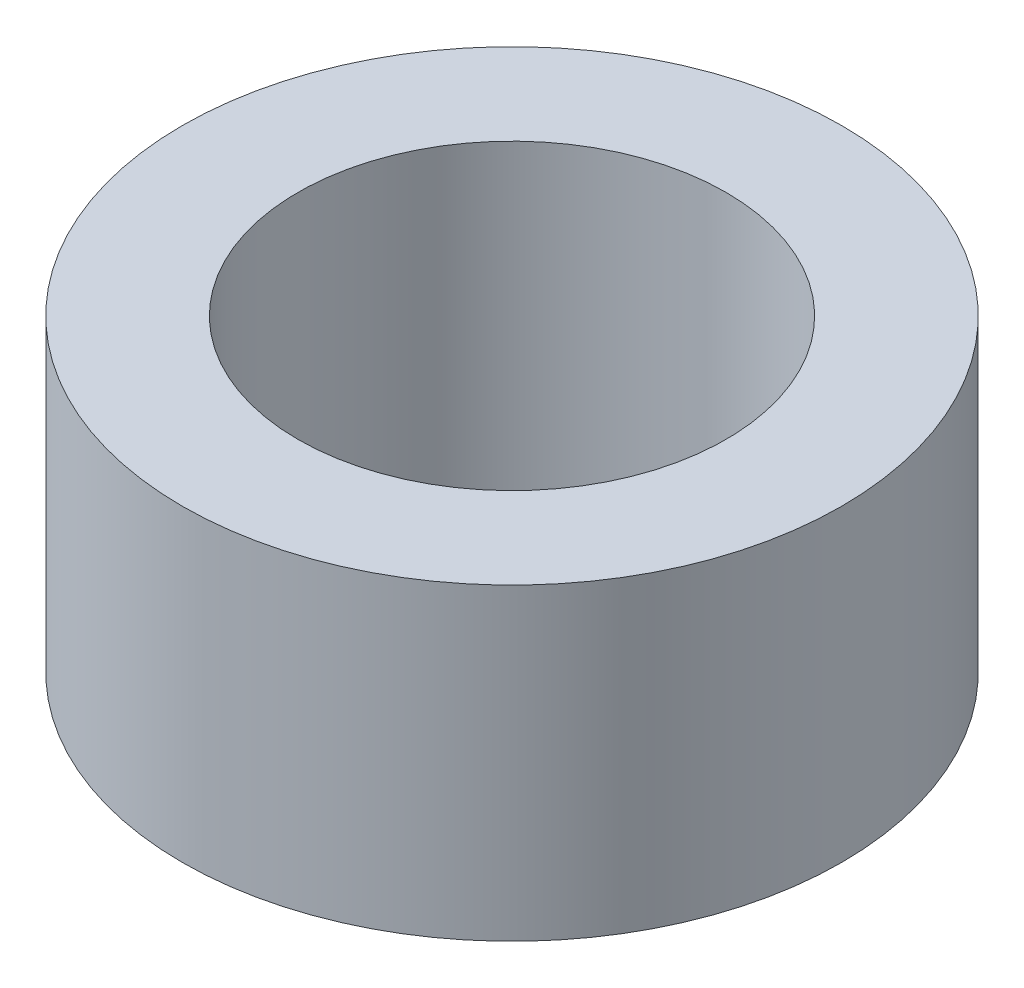
ISO-10303-21;
HEADER;
FILE_DESCRIPTION(('STEP AP214'),'2;1');
FILE_NAME('part.step','',(''),(''),'','','');
FILE_SCHEMA(('AUTOMOTIVE_DESIGN { 1 0 10303 214 1 1 1 1 }'));
ENDSEC;
DATA;
#1=APPLICATION_CONTEXT('core data for automotive mechanical design processes');
#2=APPLICATION_PROTOCOL_DEFINITION('international standard','automotive_design',2000,#1);
#3=PRODUCT_CONTEXT('',#1,'mechanical');
#4=PRODUCT('Part','Part','',(#3));
#5=PRODUCT_RELATED_PRODUCT_CATEGORY('part','',(#4));
#6=PRODUCT_DEFINITION_FORMATION('','',#4);
#7=PRODUCT_DEFINITION_CONTEXT('part definition',#1,'design');
#8=PRODUCT_DEFINITION('design','',#6,#7);
#9=PRODUCT_DEFINITION_SHAPE('','',#8);
#10=(LENGTH_UNIT() NAMED_UNIT(*) SI_UNIT(.MILLI.,.METRE.));
#11=(NAMED_UNIT(*) PLANE_ANGLE_UNIT() SI_UNIT($,.RADIAN.));
#12=(NAMED_UNIT(*) SI_UNIT($,.STERADIAN.) SOLID_ANGLE_UNIT());
#13=UNCERTAINTY_MEASURE_WITH_UNIT(LENGTH_MEASURE(1.E-05),#10,'distance_accuracy_value','');
#14=(GEOMETRIC_REPRESENTATION_CONTEXT(3) GLOBAL_UNCERTAINTY_ASSIGNED_CONTEXT((#13)) GLOBAL_UNIT_ASSIGNED_CONTEXT((#10,
#11,#12)) REPRESENTATION_CONTEXT('',''));
#15=CARTESIAN_POINT('',(0.,0.,0.));
#16=DIRECTION('',(0.,0.,1.));
#17=DIRECTION('',(1.,0.,0.));
#18=AXIS2_PLACEMENT_3D('',#15,#16,#17);
#19=CARTESIAN_POINT('',(0.,4.,0.));
#20=DIRECTION('',(0.,1.,0.));
#21=DIRECTION('',(0.,0.,1.));
#22=AXIS2_PLACEMENT_3D('',#19,#20,#21);
#23=PLANE('',#22);
#24=CARTESIAN_POINT('',(0.,4.,0.));
#25=DIRECTION('',(0.,1.,0.));
#26=DIRECTION('',(0.,0.,1.));
#27=AXIS2_PLACEMENT_3D('',#24,#25,#26);
#28=CIRCLE('',#27,4.275);
#29=CARTESIAN_POINT('',(0.,4.,4.275));
#30=VERTEX_POINT('',#29);
#31=EDGE_CURVE('E10',#30,#30,#28,.T.);
#32=ORIENTED_EDGE('',*,*,#31,.T.);
#33=EDGE_LOOP('',(#32));
#34=FACE_BOUND('',#33,.T.);
#35=CARTESIAN_POINT('',(0.,4.,0.));
#36=DIRECTION('',(0.,1.,0.));
#37=DIRECTION('',(0.,0.,1.));
#38=AXIS2_PLACEMENT_3D('',#35,#36,#37);
#39=CIRCLE('',#38,2.775);
#40=CARTESIAN_POINT('',(0.,4.,2.775));
#41=VERTEX_POINT('',#40);
#42=EDGE_CURVE('E50',#41,#41,#39,.T.);
#43=ORIENTED_EDGE('',*,*,#42,.F.);
#44=EDGE_LOOP('',(#43));
#45=FACE_BOUND('',#44,.T.);
#46=ADVANCED_FACE('F37',(#34,#45),#23,.T.);
#47=CARTESIAN_POINT('',(0.,0.,0.));
#48=DIRECTION('',(0.,1.,0.));
#49=DIRECTION('',(0.,0.,1.));
#50=AXIS2_PLACEMENT_3D('',#47,#48,#49);
#51=PLANE('',#50);
#52=CARTESIAN_POINT('',(0.,0.,0.));
#53=DIRECTION('',(0.,1.,0.));
#54=DIRECTION('',(0.,0.,1.));
#55=AXIS2_PLACEMENT_3D('',#52,#53,#54);
#56=CIRCLE('',#55,4.275);
#57=CARTESIAN_POINT('',(0.,0.,4.275));
#58=VERTEX_POINT('',#57);
#59=EDGE_CURVE('E41',#58,#58,#56,.T.);
#60=ORIENTED_EDGE('',*,*,#59,.F.);
#61=EDGE_LOOP('',(#60));
#62=FACE_BOUND('',#61,.T.);
#63=CARTESIAN_POINT('',(0.,0.,0.));
#64=DIRECTION('',(0.,1.,0.));
#65=DIRECTION('',(0.,0.,1.));
#66=AXIS2_PLACEMENT_3D('',#63,#64,#65);
#67=CIRCLE('',#66,2.775);
#68=CARTESIAN_POINT('',(0.,0.,2.775));
#69=VERTEX_POINT('',#68);
#70=EDGE_CURVE('E52',#69,#69,#67,.T.);
#71=ORIENTED_EDGE('',*,*,#70,.T.);
#72=EDGE_LOOP('',(#71));
#73=FACE_BOUND('',#72,.T.);
#74=ADVANCED_FACE('F64',(#62,#73),#51,.F.);
#75=CARTESIAN_POINT('',(0.,4.,0.));
#76=DIRECTION('',(0.,-1.,0.));
#77=DIRECTION('',(0.,0.,-1.));
#78=AXIS2_PLACEMENT_3D('',#75,#76,#77);
#79=CYLINDRICAL_SURFACE('',#78,4.275);
#80=ORIENTED_EDGE('',*,*,#31,.F.);
#81=EDGE_LOOP('',(#80));
#82=FACE_BOUND('',#81,.T.);
#83=ORIENTED_EDGE('',*,*,#59,.T.);
#84=EDGE_LOOP('',(#83));
#85=FACE_BOUND('',#84,.T.);
#86=ADVANCED_FACE('F39',(#82,#85),#79,.T.);
#87=CARTESIAN_POINT('',(0.,4.,0.));
#88=DIRECTION('',(0.,-1.,0.));
#89=DIRECTION('',(0.,0.,-1.));
#90=AXIS2_PLACEMENT_3D('',#87,#88,#89);
#91=CYLINDRICAL_SURFACE('',#90,2.775);
#92=ORIENTED_EDGE('',*,*,#42,.T.);
#93=EDGE_LOOP('',(#92));
#94=FACE_BOUND('',#93,.T.);
#95=ORIENTED_EDGE('',*,*,#70,.F.);
#96=EDGE_LOOP('',(#95));
#97=FACE_BOUND('',#96,.T.);
#98=ADVANCED_FACE('F60',(#94,#97),#91,.F.);
#99=CLOSED_SHELL('',(#46,#74,#86,#98));
#100=MANIFOLD_SOLID_BREP('B2',#99);
#101=ADVANCED_BREP_SHAPE_REPRESENTATION('',(#18,#100),#14);
#102=SHAPE_DEFINITION_REPRESENTATION(#9,#101);
ENDSEC;
END-ISO-10303-21;
